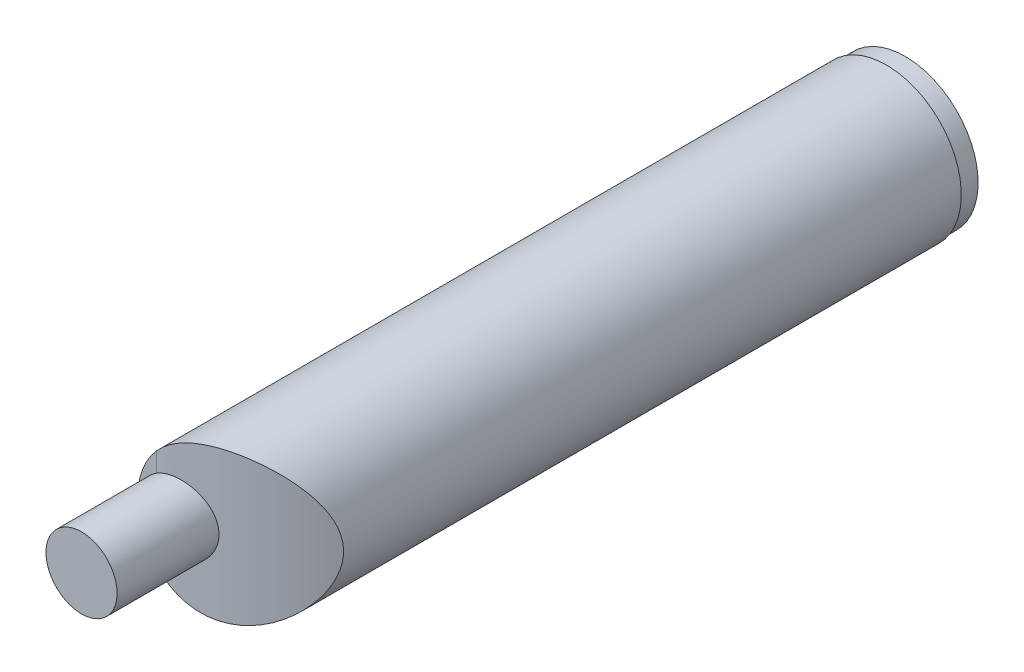
ISO-10303-21;
HEADER;
FILE_DESCRIPTION(('STEP AP214'),'2;1');
FILE_NAME('part.step','',(''),(''),'','','');
FILE_SCHEMA(('AUTOMOTIVE_DESIGN { 1 0 10303 214 1 1 1 1 }'));
ENDSEC;
DATA;
#1=APPLICATION_CONTEXT('core data for automotive mechanical design processes');
#2=APPLICATION_PROTOCOL_DEFINITION('international standard','automotive_design',2000,#1);
#3=PRODUCT_CONTEXT('',#1,'mechanical');
#4=PRODUCT('Part','Part','',(#3));
#5=PRODUCT_RELATED_PRODUCT_CATEGORY('part','',(#4));
#6=PRODUCT_DEFINITION_FORMATION('','',#4);
#7=PRODUCT_DEFINITION_CONTEXT('part definition',#1,'design');
#8=PRODUCT_DEFINITION('design','',#6,#7);
#9=PRODUCT_DEFINITION_SHAPE('','',#8);
#10=(LENGTH_UNIT() NAMED_UNIT(*) SI_UNIT(.MILLI.,.METRE.));
#11=(NAMED_UNIT(*) PLANE_ANGLE_UNIT() SI_UNIT($,.RADIAN.));
#12=(NAMED_UNIT(*) SI_UNIT($,.STERADIAN.) SOLID_ANGLE_UNIT());
#13=UNCERTAINTY_MEASURE_WITH_UNIT(LENGTH_MEASURE(1.E-05),#10,'distance_accuracy_value','');
#14=(GEOMETRIC_REPRESENTATION_CONTEXT(3) GLOBAL_UNCERTAINTY_ASSIGNED_CONTEXT((#13)) GLOBAL_UNIT_ASSIGNED_CONTEXT((#10,
#11,#12)) REPRESENTATION_CONTEXT('',''));
#15=CARTESIAN_POINT('',(0.,0.,0.));
#16=DIRECTION('',(0.,0.,1.));
#17=DIRECTION('',(1.,0.,0.));
#18=AXIS2_PLACEMENT_3D('',#15,#16,#17);
#19=CARTESIAN_POINT('',(0.,0.,37.));
#20=DIRECTION('',(0.,0.,1.));
#21=DIRECTION('',(1.,0.,0.));
#22=AXIS2_PLACEMENT_3D('',#19,#20,#21);
#23=PLANE('',#22);
#24=DIRECTION('',(0.,1.,0.));
#25=VECTOR('',#24,1.);
#26=CARTESIAN_POINT('',(-3.,-4.,37.));
#27=LINE('',#26,#25);
#28=CARTESIAN_POINT('',(-3.,-1.61554944214035,37.));
#29=VERTEX_POINT('',#28);
#30=CARTESIAN_POINT('',(-3.,-2.64575131106459,37.));
#31=VERTEX_POINT('',#30);
#32=EDGE_CURVE('E44',#29,#31,#27,.F.);
#33=ORIENTED_EDGE('',*,*,#32,.F.);
#34=CARTESIAN_POINT('',(-2.,0.,37.));
#35=DIRECTION('',(0.,0.,1.));
#36=DIRECTION('',(1.,0.,0.));
#37=AXIS2_PLACEMENT_3D('',#34,#35,#36);
#38=CIRCLE('',#37,1.9);
#39=CARTESIAN_POINT('',(-3.,1.61554944214035,37.));
#40=VERTEX_POINT('',#39);
#41=EDGE_CURVE('E84',#40,#29,#38,.T.);
#42=ORIENTED_EDGE('',*,*,#41,.F.);
#43=CARTESIAN_POINT('',(-3.,2.64575131106459,37.));
#44=VERTEX_POINT('',#43);
#45=EDGE_CURVE('E11',#44,#40,#27,.F.);
#46=ORIENTED_EDGE('',*,*,#45,.F.);
#47=CARTESIAN_POINT('',(0.,0.,37.));
#48=DIRECTION('',(0.,0.,1.));
#49=DIRECTION('',(1.,0.,0.));
#50=AXIS2_PLACEMENT_3D('',#47,#48,#49);
#51=CIRCLE('',#50,4.);
#52=EDGE_CURVE('E118',#44,#31,#51,.T.);
#53=ORIENTED_EDGE('',*,*,#52,.T.);
#54=EDGE_LOOP('',(#33,#42,#46,#53));
#55=FACE_BOUND('',#54,.T.);
#56=ADVANCED_FACE('F35',(#55),#23,.T.);
#57=CARTESIAN_POINT('',(-3.,-4.,27.3333333333333));
#58=DIRECTION('',(0.,1.,0.));
#59=DIRECTION('',(0.,0.,1.));
#60=AXIS2_PLACEMENT_3D('',#57,#58,#59);
#61=CYLINDRICAL_SURFACE('',#60,9.66666666666666);
#62=CARTESIAN_POINT('',(-3.,-1.61554944214035,37.));
#63=CARTESIAN_POINT('',(-2.95517958061528,-1.64329252204888,37.000001032105));
#64=CARTESIAN_POINT('',(-2.90922461089328,-1.66915645677503,36.99968779637));
#65=CARTESIAN_POINT('',(-2.8153357049746,-1.71697580833333,36.9983500260045));
#66=CARTESIAN_POINT('',(-2.76740181313537,-1.73893131271423,36.9973255073091));
#67=CARTESIAN_POINT('',(-2.6212541707077,-1.79863383992959,36.9930664159992));
#68=CARTESIAN_POINT('',(-2.52051730289532,-1.83032626236258,36.9886469520318));
#69=CARTESIAN_POINT('',(-2.31538706046502,-1.87659482098436,36.9762750540139));
#70=CARTESIAN_POINT('',(-2.21099152213248,-1.89116064651174,36.9683204957099));
#71=CARTESIAN_POINT('',(-2.00156850833603,-1.90288972701268,36.9488743750572));
#72=CARTESIAN_POINT('',(-1.89654115152249,-1.90005615344103,36.9373834576568));
#73=CARTESIAN_POINT('',(-1.68850211351172,-1.87721945316173,36.91119557089));
#74=CARTESIAN_POINT('',(-1.58549661541911,-1.85717015455387,36.8964900592374));
#75=CARTESIAN_POINT('',(-1.38450616355193,-1.80057583544492,36.8645971177407));
#76=CARTESIAN_POINT('',(-1.28652279026819,-1.76402565708877,36.8474089129983));
#77=CARTESIAN_POINT('',(-1.09588130480718,-1.67448991963964,36.8111187186533));
#78=CARTESIAN_POINT('',(-1.0034004134651,-1.62114133626977,36.7919814750124));
#79=CARTESIAN_POINT('',(-0.828686284516865,-1.49978030894426,36.753410691243));
#80=CARTESIAN_POINT('',(-0.746453997099637,-1.43176650691134,36.7339771238283));
#81=CARTESIAN_POINT('',(-0.592888034908227,-1.2813319837602,36.6958462018077));
#82=CARTESIAN_POINT('',(-0.521799029763533,-1.19865545897162,36.6771706859926));
#83=CARTESIAN_POINT('',(-0.39457622075868,-1.02198823257589,36.6424994167669));
#84=CARTESIAN_POINT('',(-0.338441569956993,-0.927998172149993,36.6265035116151));
#85=CARTESIAN_POINT('',(-0.243703350100563,-0.732805740717833,36.5988437200598));
#86=CARTESIAN_POINT('',(-0.204839366821026,-0.631739134851262,36.5871160035496));
#87=CARTESIAN_POINT('',(-0.144776397894455,-0.424052009574895,36.5687619987074));
#88=CARTESIAN_POINT('',(-0.123571639667147,-0.317433317191539,36.5621340433809));
#89=CARTESIAN_POINT('',(-0.100137065887266,-0.106410831973574,36.554796497094));
#90=CARTESIAN_POINT('',(-0.0971586472445877,-0.00209784625910809,36.5538534378124));
#91=CARTESIAN_POINT('',(-0.108289649199356,0.205512126969769,36.5573503167647));
#92=CARTESIAN_POINT('',(-0.122397254689809,0.308809221230669,36.5617896832053));
#93=CARTESIAN_POINT('',(-0.166773455177286,0.509572862967182,36.575507918806));
#94=CARTESIAN_POINT('',(-0.196749392878213,0.607110532850305,36.5846990817445));
#95=CARTESIAN_POINT('',(-0.271682870831143,0.795754152379224,36.6070731491861));
#96=CARTESIAN_POINT('',(-0.31664246828715,0.886859216768184,36.6202566017938));
#97=CARTESIAN_POINT('',(-0.421623582745281,1.06278158376739,36.6499563718835));
#98=CARTESIAN_POINT('',(-0.482022001466008,1.14736002773485,36.6665536892428));
#99=CARTESIAN_POINT('',(-0.615542613626594,1.30536678920883,36.701554233994));
#100=CARTESIAN_POINT('',(-0.688667424953865,1.37879280677008,36.7199578326072));
#101=CARTESIAN_POINT('',(-0.848891226532715,1.51540810472139,36.7579927900611));
#102=CARTESIAN_POINT('',(-0.936427285850951,1.5780800692756,36.7776439535781));
#103=CARTESIAN_POINT('',(-1.12096236909848,1.68784476875298,36.8160827448242));
#104=CARTESIAN_POINT('',(-1.21796247175424,1.73493572503594,36.8348702737549));
#105=CARTESIAN_POINT('',(-1.41981129037897,1.81250569515798,36.8705256886973));
#106=CARTESIAN_POINT('',(-1.52472482666052,1.84282551461708,36.8873740152814));
#107=CARTESIAN_POINT('',(-1.73862747103469,1.88508947435926,36.9179586742784));
#108=CARTESIAN_POINT('',(-1.8476158207198,1.89703701683703,36.9316955824646));
#109=CARTESIAN_POINT('',(-2.06397514459689,1.90193516242466,36.9551774101759));
#110=CARTESIAN_POINT('',(-2.17132786900129,1.89530412930968,36.965004643056));
#111=CARTESIAN_POINT('',(-2.3836381394675,1.86395281080554,36.9809165360836));
#112=CARTESIAN_POINT('',(-2.48859668876145,1.8392402512428,36.9870027926224));
#113=CARTESIAN_POINT('',(-2.66240982445681,1.78238939027777,36.9943707269203));
#114=CARTESIAN_POINT('',(-2.73270356887788,1.75465776673282,36.9965436444483));
#115=CARTESIAN_POINT('',(-2.86944648349164,1.69108093258636,36.9993623525555));
#116=CARTESIAN_POINT('',(-2.93590033823768,1.65524588202983,37.000010043949));
#117=CARTESIAN_POINT('',(-3.,1.61554944214035,37.));
#118=B_SPLINE_CURVE_WITH_KNOTS('',3,(#62,#63,#64,#65,#66,#67,#68,#69,#70,#71,#72,#73,#74,#75,
#76,#77,#78,#79,#80,#81,#82,#83,#84,#85,#86,#87,#88,#89,#90,#91,#92,#93,#94,#95,#96,#97,#98,#99,
#100,#101,#102,#103,#104,#105,#106,#107,#108,#109,#110,#111,#112,#113,#114,#115,#116,#117),
.UNSPECIFIED.,.F.,.F.,(4,2,2,2,2,2,2,2,2,2,2,2,2,2,2,2,2,2,2,2,2,2,2,2,2,2,2,4),(0.,
0.158040314803775,0.316077089062983,0.631533991882929,0.947180710968673,1.26276989763209,
1.57920813522519,1.89574535383446,2.21965622731877,2.54359710956618,2.8738749919205,
3.2041341649715,3.52922893911353,3.85421740207206,4.16576295753149,4.47727541934,
4.7832332041926,5.08923301329486,5.40356767110819,5.71796706584309,6.04475389049804,
6.37157800643768,6.70145336718532,7.03126763395883,7.35371501333552,7.67602469865251,
7.90229726183293,8.12828768306414),.UNSPECIFIED.);
#119=EDGE_CURVE('E50',#29,#40,#118,.T.);
#120=ORIENTED_EDGE('',*,*,#119,.F.);
#121=ORIENTED_EDGE('',*,*,#32,.T.);
#122=CARTESIAN_POINT('',(-3.,2.64575131106459,37.));
#123=CARTESIAN_POINT('',(-2.92874344411386,2.72656833880474,37.0000026929973));
#124=CARTESIAN_POINT('',(-2.85419861601261,2.80449367333995,36.9992124183074));
#125=CARTESIAN_POINT('',(-2.69908461475097,2.95406911188603,36.9956259653642));
#126=CARTESIAN_POINT('',(-2.61851460338466,3.02571833976148,36.9928295075499));
#127=CARTESIAN_POINT('',(-2.45194175088313,3.16221122973203,36.9848114066328));
#128=CARTESIAN_POINT('',(-2.36594016231447,3.22705645177371,36.9795903209178));
#129=CARTESIAN_POINT('',(-2.1891422961328,3.34950981012562,36.966339585779));
#130=CARTESIAN_POINT('',(-2.09834637843114,3.40711848859081,36.9583101469251));
#131=CARTESIAN_POINT('',(-1.91252526820566,3.51479661198446,36.9390909359259));
#132=CARTESIAN_POINT('',(-1.81749402150079,3.56485478485893,36.9278965090374));
#133=CARTESIAN_POINT('',(-1.62406290496324,3.6570345748119,36.9020722430745));
#134=CARTESIAN_POINT('',(-1.52566181382864,3.69915327770852,36.8874411469797));
#135=CARTESIAN_POINT('',(-1.32645424821065,3.77516501795386,36.8545657396904));
#136=CARTESIAN_POINT('',(-1.22565072312854,3.80906762291307,36.8363256765417));
#137=CARTESIAN_POINT('',(-1.02232354130945,3.86860205669459,36.7961017357514));
#138=CARTESIAN_POINT('',(-0.919799266398736,3.89423084324482,36.7741164855384));
#139=CARTESIAN_POINT('',(-0.715658602760959,3.93681512441491,36.7267890383231));
#140=CARTESIAN_POINT('',(-0.614056849194816,3.95391197938267,36.7015109591809));
#141=CARTESIAN_POINT('',(-0.410768834027507,3.98017475638854,36.6473776930199));
#142=CARTESIAN_POINT('',(-0.309082555208066,3.98933784626417,36.6185212328045));
#143=CARTESIAN_POINT('',(-0.0049603327433194,4.00513483658308,36.5267464130026));
#144=CARTESIAN_POINT('',(0.196628289481214,4.00009461277808,36.4586020395277));
#145=CARTESIAN_POINT('',(0.60159714223103,3.95998913295275,36.3067391447954));
#146=CARTESIAN_POINT('',(0.804608512255116,3.92351054570256,36.2224350600644));
#147=CARTESIAN_POINT('',(1.19833185521531,3.82169635277293,36.043399861453));
#148=CARTESIAN_POINT('',(1.38904220917318,3.75635695747048,35.9486673794791));
#149=CARTESIAN_POINT('',(1.77881397658153,3.58975378245759,35.7394239085914));
#150=CARTESIAN_POINT('',(1.97583567187145,3.48496978989151,35.6239316169755));
#151=CARTESIAN_POINT('',(2.34848795692548,3.24557442011722,35.388563858778));
#152=CARTESIAN_POINT('',(2.52408306453907,3.11091458065686,35.2686815378944));
#153=CARTESIAN_POINT('',(2.78045845835395,2.8783237558762,35.0821387269153));
#154=CARTESIAN_POINT('',(2.86940372121545,2.7896912950124,35.0148812345799));
#155=CARTESIAN_POINT('',(3.03920127263234,2.60367379812992,34.8821138878305));
#156=CARTESIAN_POINT('',(3.12005138772456,2.50628642475712,34.8166045062104));
#157=CARTESIAN_POINT('',(3.27293183980788,2.30305505681702,34.6889214332201));
#158=CARTESIAN_POINT('',(3.34497539956034,2.19722414488533,34.6267428216752));
#159=CARTESIAN_POINT('',(3.47959564824296,1.97712970024364,34.5074099851794));
#160=CARTESIAN_POINT('',(3.54217800392595,1.862871276672,34.4502527613502));
#161=CARTESIAN_POINT('',(3.6733067083788,1.59229689241465,34.3277295748455));
#162=CARTESIAN_POINT('',(3.73848625178331,1.43326221995032,34.2646530121973));
#163=CARTESIAN_POINT('',(3.84889048744412,1.10282032668692,34.1555939474905));
#164=CARTESIAN_POINT('',(3.89414575035773,0.931432533371165,34.1095852746483));
#165=CARTESIAN_POINT('',(3.9450656101658,0.666849780157054,34.057252527945));
#166=CARTESIAN_POINT('',(3.95924359622614,0.576861003822951,34.0425525829217));
#167=CARTESIAN_POINT('',(3.98146204643081,0.39534983419803,34.0194305776106));
#168=CARTESIAN_POINT('',(3.98950564335262,0.303828248138117,34.0110053129517));
#169=CARTESIAN_POINT('',(3.9992539324286,0.120106231005828,34.0007871795469));
#170=CARTESIAN_POINT('',(4.00096084884665,0.0279060495187175,33.998991983555));
#171=CARTESIAN_POINT('',(3.99800956039643,-0.156250856689758,34.0020890037284));
#172=CARTESIAN_POINT('',(3.99335190956097,-0.248207601904009,34.006980637808));
#173=CARTESIAN_POINT('',(3.97215891080682,-0.496716627410485,34.0291436665878));
#174=CARTESIAN_POINT('',(3.94949691645758,-0.652247912010089,34.0527815522623));
#175=CARTESIAN_POINT('',(3.88713995385376,-0.956205609506684,34.1166721530481));
#176=CARTESIAN_POINT('',(3.84743163376507,-1.1046263514359,34.1569378912745));
#177=CARTESIAN_POINT('',(3.73434636457543,-1.44883757630186,34.268861751576));
#178=CARTESIAN_POINT('',(3.65386958599505,-1.64029342739702,34.3466379694382));
#179=CARTESIAN_POINT('',(3.46827071755913,-2.00321014569202,34.5181698266454));
#180=CARTESIAN_POINT('',(3.36309068199038,-2.17462255942295,34.6119628928663));
#181=CARTESIAN_POINT('',(3.17302908125662,-2.43886018136553,34.77293631463));
#182=CARTESIAN_POINT('',(3.09438518485591,-2.53783125026085,34.8376052673484));
#183=CARTESIAN_POINT('',(2.92889605003813,-2.72715528020355,34.9690246136126));
#184=CARTESIAN_POINT('',(2.84205181617015,-2.81750929412967,35.035774751542));
#185=CARTESIAN_POINT('',(2.66059908004062,-2.98945489693459,35.170093958532));
#186=CARTESIAN_POINT('',(2.56598755144775,-3.07104304155433,35.2376633379663));
#187=CARTESIAN_POINT('',(2.36941399426397,-3.22513131932479,35.3724901121093));
#188=CARTESIAN_POINT('',(2.26745170472932,-3.29763112959941,35.4397474956521));
#189=CARTESIAN_POINT('',(2.05592940273685,-3.4335185756147,35.5733432708493));
#190=CARTESIAN_POINT('',(1.94632725242728,-3.49684858012791,35.6396736670128));
#191=CARTESIAN_POINT('',(1.72056966757837,-3.61327567922718,35.7700178673663));
#192=CARTESIAN_POINT('',(1.60441706478977,-3.66637715241393,35.8340326532417));
#193=CARTESIAN_POINT('',(1.36609998442459,-3.76167969117209,35.9588595655241));
#194=CARTESIAN_POINT('',(1.2439370362538,-3.80388351287906,36.0196724986111));
#195=CARTESIAN_POINT('',(0.994299413887674,-3.87663063623035,36.1372554002671));
#196=CARTESIAN_POINT('',(0.866825286990128,-3.90717513604572,36.1940257837809));
#197=CARTESIAN_POINT('',(0.615209704788986,-3.95435358487173,36.2995026290934));
#198=CARTESIAN_POINT('',(0.491320360166209,-3.97170630685601,36.3484878146022));
#199=CARTESIAN_POINT('',(0.240666934792276,-3.99473547119685,36.4415925713768));
#200=CARTESIAN_POINT('',(0.113903386958178,-4.00041406048712,36.4857130358772));
#201=CARTESIAN_POINT('',(-0.141158899570027,-3.99953951234272,36.568560900307));
#202=CARTESIAN_POINT('',(-0.269455377659925,-3.99300259761301,36.6072953796598));
#203=CARTESIAN_POINT('',(-0.526366383009214,-3.96731572070123,36.6791002494506));
#204=CARTESIAN_POINT('',(-0.654980846579341,-3.94816810799916,36.7121716935145));
#205=CARTESIAN_POINT('',(-0.891784160558105,-3.90090187363558,36.7679704774545));
#206=CARTESIAN_POINT('',(-1.00014120857132,-3.8745611977658,36.7915053674445));
#207=CARTESIAN_POINT('',(-1.2150221843455,-3.81263927728932,36.834401517043));
#208=CARTESIAN_POINT('',(-1.32154629778644,-3.77705897462191,36.8537632017235));
#209=CARTESIAN_POINT('',(-1.5318585319108,-3.69676741392903,36.8884563172856));
#210=CARTESIAN_POINT('',(-1.63564466850679,-3.6520497291307,36.9037848940276));
#211=CARTESIAN_POINT('',(-1.8394002368921,-3.55378560828444,36.9306249770668));
#212=CARTESIAN_POINT('',(-1.93937155404759,-3.50024360486655,36.9421383910983));
#213=CARTESIAN_POINT('',(-2.12678834417478,-3.38934466065737,36.9609027178673));
#214=CARTESIAN_POINT('',(-2.21459458939223,-3.3326408074284,36.9684219620944));
#215=CARTESIAN_POINT('',(-2.38561874174949,-3.21243652656539,36.9808372444938));
#216=CARTESIAN_POINT('',(-2.46883673733721,-3.14893623001616,36.9857333332485));
#217=CARTESIAN_POINT('',(-2.63007558090121,-3.01556644041895,36.9932563104231));
#218=CARTESIAN_POINT('',(-2.70809754974447,-2.94569832876424,36.995883689713));
#219=CARTESIAN_POINT('',(-2.85844676860409,-2.80004656197124,36.9992566353157));
#220=CARTESIAN_POINT('',(-2.93077430750579,-2.72426320730934,37.00000229715));
#221=CARTESIAN_POINT('',(-3.,-2.64575131106459,37.));
#222=B_SPLINE_CURVE_WITH_KNOTS('',3,(#122,#123,#124,#125,#126,#127,#128,#129,#130,#131,#132,
#133,#134,#135,#136,#137,#138,#139,#140,#141,#142,#143,#144,#145,#146,#147,#148,#149,#150,#151,
#152,#153,#154,#155,#156,#157,#158,#159,#160,#161,#162,#163,#164,#165,#166,#167,#168,#169,#170,
#171,#172,#173,#174,#175,#176,#177,#178,#179,#180,#181,#182,#183,#184,#185,#186,#187,#188,#189,
#190,#191,#192,#193,#194,#195,#196,#197,#198,#199,#200,#201,#202,#203,#204,#205,#206,#207,#208,
#209,#210,#211,#212,#213,#214,#215,#216,#217,#218,#219,#220,#221),.UNSPECIFIED.,.F.,.F.,(4,2,2,
2,2,2,2,2,2,2,2,2,2,2,2,2,2,2,2,2,2,2,2,2,2,2,2,2,2,2,2,2,2,2,2,2,2,2,2,2,2,2,2,2,2,2,2,2,2,4),
(0.,0.323151788824282,0.646348617516144,0.969471184585408,1.29256952916285,1.6161455481066,
1.9398401053201,2.26315589058986,2.58659042359854,2.90447177161188,3.22246654885787,
3.85817917591133,4.52405618483309,5.19002065399946,5.94096570991291,6.69313791381484,
7.12004478936913,7.54706597935071,7.97343792306898,8.3995534724468,8.94687201143385,
9.49334782487741,9.76981271888793,10.0461363300379,10.3223629385426,10.5985655031729,
11.073059726387,11.5479262856007,12.2096037451962,12.8728490628248,13.2983607030934,
13.7238202852411,14.149446431004,14.5750876934629,15.0032976464844,15.4313238832305,
15.8592417611832,16.2871156522773,16.6895630866289,17.0919365021818,17.4937759285841,
17.8955405100628,18.2370001885217,18.5784250703256,18.920090924887,19.2615856741056,
19.5756170306025,19.8896423313843,20.2035996709303,20.5175410727621),.UNSPECIFIED.);
#223=EDGE_CURVE('E55',#44,#31,#222,.T.);
#224=ORIENTED_EDGE('',*,*,#223,.F.);
#225=ORIENTED_EDGE('',*,*,#45,.T.);
#226=EDGE_LOOP('',(#120,#121,#224,#225));
#227=FACE_BOUND('',#226,.T.);
#228=ADVANCED_FACE('F100',(#227),#61,.T.);
#229=CARTESIAN_POINT('',(0.,0.,37.));
#230=DIRECTION('',(0.,0.,-1.));
#231=DIRECTION('',(-1.,0.,0.));
#232=AXIS2_PLACEMENT_3D('',#229,#230,#231);
#233=CYLINDRICAL_SURFACE('',#232,4.);
#234=CARTESIAN_POINT('',(0.,0.,1.));
#235=DIRECTION('',(0.,0.,-1.));
#236=DIRECTION('',(-1.,0.,0.));
#237=AXIS2_PLACEMENT_3D('',#234,#235,#236);
#238=CIRCLE('',#237,4.);
#239=CARTESIAN_POINT('',(-4.,0.,1.));
#240=VERTEX_POINT('',#239);
#241=EDGE_CURVE('E115',#240,#240,#238,.T.);
#242=ORIENTED_EDGE('',*,*,#241,.F.);
#243=EDGE_LOOP('',(#242));
#244=FACE_BOUND('',#243,.T.);
#245=ORIENTED_EDGE('',*,*,#52,.F.);
#246=ORIENTED_EDGE('',*,*,#223,.T.);
#247=EDGE_LOOP('',(#245,#246));
#248=FACE_BOUND('',#247,.T.);
#249=ADVANCED_FACE('F37',(#244,#248),#233,.T.);
#250=CARTESIAN_POINT('',(0.,0.,1.));
#251=DIRECTION('',(0.,0.,-1.));
#252=DIRECTION('',(-1.,0.,0.));
#253=AXIS2_PLACEMENT_3D('',#250,#251,#252);
#254=CYLINDRICAL_SURFACE('',#253,3.9);
#255=CARTESIAN_POINT('',(0.,0.,1.));
#256=DIRECTION('',(0.,0.,-1.));
#257=DIRECTION('',(-1.,0.,0.));
#258=AXIS2_PLACEMENT_3D('',#255,#256,#257);
#259=CIRCLE('',#258,3.9);
#260=CARTESIAN_POINT('',(-3.9,0.,1.));
#261=VERTEX_POINT('',#260);
#262=EDGE_CURVE('E112',#261,#261,#259,.T.);
#263=ORIENTED_EDGE('',*,*,#262,.T.);
#264=EDGE_LOOP('',(#263));
#265=FACE_BOUND('',#264,.T.);
#266=CARTESIAN_POINT('',(0.,0.,0.));
#267=DIRECTION('',(0.,0.,-1.));
#268=DIRECTION('',(-1.,0.,0.));
#269=AXIS2_PLACEMENT_3D('',#266,#267,#268);
#270=CIRCLE('',#269,3.9);
#271=CARTESIAN_POINT('',(-3.9,0.,0.));
#272=VERTEX_POINT('',#271);
#273=EDGE_CURVE('E111',#272,#272,#270,.T.);
#274=ORIENTED_EDGE('',*,*,#273,.F.);
#275=EDGE_LOOP('',(#274));
#276=FACE_BOUND('',#275,.T.);
#277=ADVANCED_FACE('F127',(#265,#276),#254,.T.);
#278=CARTESIAN_POINT('',(0.,0.,1.));
#279=DIRECTION('',(0.,0.,-1.));
#280=DIRECTION('',(-1.,0.,0.));
#281=AXIS2_PLACEMENT_3D('',#278,#279,#280);
#282=PLANE('',#281);
#283=ORIENTED_EDGE('',*,*,#262,.F.);
#284=EDGE_LOOP('',(#283));
#285=FACE_BOUND('',#284,.T.);
#286=ORIENTED_EDGE('',*,*,#241,.T.);
#287=EDGE_LOOP('',(#286));
#288=FACE_BOUND('',#287,.T.);
#289=ADVANCED_FACE('F104',(#285,#288),#282,.T.);
#290=CARTESIAN_POINT('',(0.,0.,0.));
#291=DIRECTION('',(0.,0.,1.));
#292=DIRECTION('',(1.,0.,0.));
#293=AXIS2_PLACEMENT_3D('',#290,#291,#292);
#294=PLANE('',#293);
#295=CARTESIAN_POINT('',(0.,0.,0.));
#296=DIRECTION('',(0.,0.,1.));
#297=DIRECTION('',(1.,0.,0.));
#298=AXIS2_PLACEMENT_3D('',#295,#296,#297);
#299=CIRCLE('',#298,3.5);
#300=CARTESIAN_POINT('',(3.5,0.,0.));
#301=VERTEX_POINT('',#300);
#302=EDGE_CURVE('E73',#301,#301,#299,.T.);
#303=ORIENTED_EDGE('',*,*,#302,.T.);
#304=EDGE_LOOP('',(#303));
#305=FACE_BOUND('',#304,.T.);
#306=ORIENTED_EDGE('',*,*,#273,.T.);
#307=EDGE_LOOP('',(#306));
#308=FACE_BOUND('',#307,.T.);
#309=ADVANCED_FACE('F98',(#305,#308),#294,.F.);
#310=CARTESIAN_POINT('',(-2.,0.,42.));
#311=DIRECTION('',(0.,0.,-1.));
#312=DIRECTION('',(-1.,0.,0.));
#313=AXIS2_PLACEMENT_3D('',#310,#311,#312);
#314=CYLINDRICAL_SURFACE('',#313,1.9);
#315=CARTESIAN_POINT('',(-2.,0.,42.));
#316=DIRECTION('',(0.,0.,1.));
#317=DIRECTION('',(1.,0.,0.));
#318=AXIS2_PLACEMENT_3D('',#315,#316,#317);
#319=CIRCLE('',#318,1.9);
#320=CARTESIAN_POINT('',(-0.1,0.,42.));
#321=VERTEX_POINT('',#320);
#322=EDGE_CURVE('E85',#321,#321,#319,.T.);
#323=ORIENTED_EDGE('',*,*,#322,.F.);
#324=EDGE_LOOP('',(#323));
#325=FACE_BOUND('',#324,.T.);
#326=ORIENTED_EDGE('',*,*,#41,.T.);
#327=ORIENTED_EDGE('',*,*,#119,.T.);
#328=EDGE_LOOP('',(#326,#327));
#329=FACE_BOUND('',#328,.T.);
#330=ADVANCED_FACE('F94',(#325,#329),#314,.T.);
#331=CARTESIAN_POINT('',(-2.,0.,42.));
#332=DIRECTION('',(0.,0.,1.));
#333=DIRECTION('',(1.,0.,0.));
#334=AXIS2_PLACEMENT_3D('',#331,#332,#333);
#335=PLANE('',#334);
#336=ORIENTED_EDGE('',*,*,#322,.T.);
#337=EDGE_LOOP('',(#336));
#338=FACE_BOUND('',#337,.T.);
#339=ADVANCED_FACE('F91',(#338),#335,.T.);
#340=CARTESIAN_POINT('',(0.,0.,-0.652673694771518));
#341=DIRECTION('',(0.,0.,1.));
#342=DIRECTION('',(1.,0.,0.));
#343=AXIS2_PLACEMENT_3D('',#340,#341,#342);
#344=TOROIDAL_SURFACE('',#343,2.74236087208137,1.);
#345=CARTESIAN_POINT('',(0.,0.,0.315751186571348));
#346=DIRECTION('',(0.,0.,1.));
#347=DIRECTION('',(1.,0.,0.));
#348=AXIS2_PLACEMENT_3D('',#345,#346,#347);
#349=CIRCLE('',#348,2.49305533825579);
#350=CARTESIAN_POINT('',(2.49305533825579,0.,0.315751186571348));
#351=VERTEX_POINT('',#350);
#352=EDGE_CURVE('E71',#351,#351,#349,.T.);
#353=ORIENTED_EDGE('',*,*,#352,.T.);
#354=EDGE_LOOP('',(#353));
#355=FACE_BOUND('',#354,.T.);
#356=ORIENTED_EDGE('',*,*,#302,.F.);
#357=EDGE_LOOP('',(#356));
#358=FACE_BOUND('',#357,.T.);
#359=ADVANCED_FACE('F67',(#355,#358),#344,.F.);
#360=CARTESIAN_POINT('',(0.,0.,10.));
#361=DIRECTION('',(0.,0.,1.));
#362=DIRECTION('',(0.,1.,0.));
#363=AXIS2_PLACEMENT_3D('',#360,#361,#362);
#364=SPHERICAL_SURFACE('',#363,10.);
#365=CARTESIAN_POINT('',(0.,0.,0.));
#366=VERTEX_POINT('',#365);
#367=VERTEX_LOOP('',#366);
#368=FACE_BOUND('',#367,.T.);
#369=ORIENTED_EDGE('',*,*,#352,.F.);
#370=EDGE_LOOP('',(#369));
#371=FACE_BOUND('',#370,.T.);
#372=ADVANCED_FACE('F64',(#368,#371),#364,.T.);
#373=CLOSED_SHELL('',(#56,#228,#249,#277,#289,#309,#330,#339,#359,#372));
#374=MANIFOLD_SOLID_BREP('B2',#373);
#375=ADVANCED_BREP_SHAPE_REPRESENTATION('',(#18,#374),#14);
#376=SHAPE_DEFINITION_REPRESENTATION(#9,#375);
ENDSEC;
END-ISO-10303-21;
